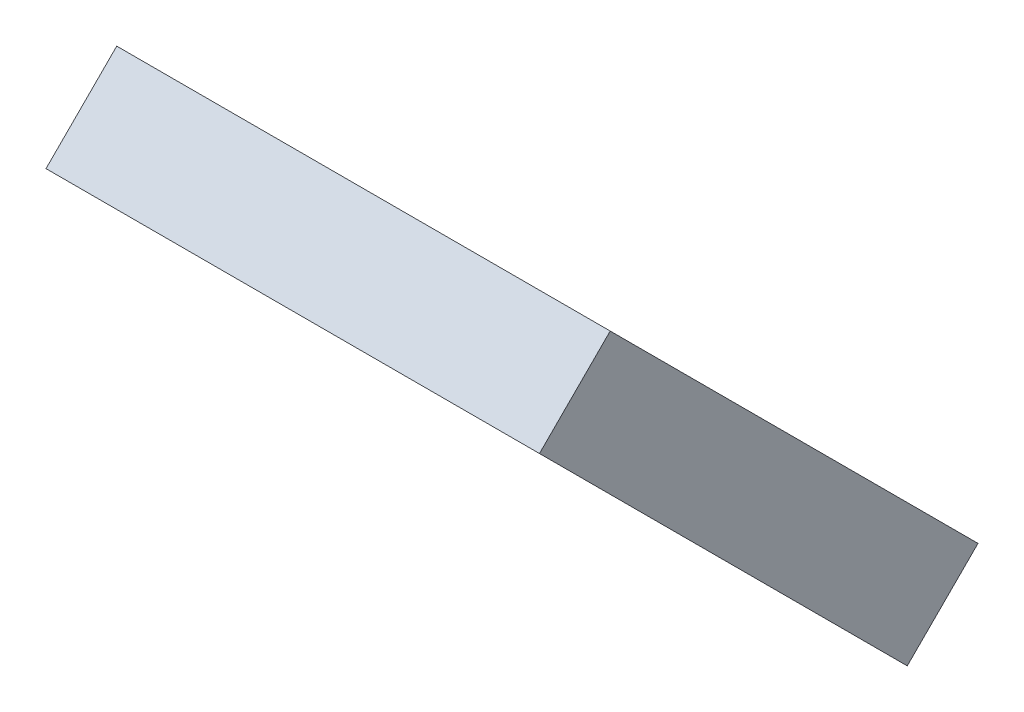
ISO-10303-21;
HEADER;
FILE_DESCRIPTION(('STEP AP214'),'2;1');
FILE_NAME('part.step','',(''),(''),'','','');
FILE_SCHEMA(('AUTOMOTIVE_DESIGN { 1 0 10303 214 1 1 1 1 }'));
ENDSEC;
DATA;
#1=APPLICATION_CONTEXT('core data for automotive mechanical design processes');
#2=APPLICATION_PROTOCOL_DEFINITION('international standard','automotive_design',2000,#1);
#3=PRODUCT_CONTEXT('',#1,'mechanical');
#4=PRODUCT('Part','Part','',(#3));
#5=PRODUCT_RELATED_PRODUCT_CATEGORY('part','',(#4));
#6=PRODUCT_DEFINITION_FORMATION('','',#4);
#7=PRODUCT_DEFINITION_CONTEXT('part definition',#1,'design');
#8=PRODUCT_DEFINITION('design','',#6,#7);
#9=PRODUCT_DEFINITION_SHAPE('','',#8);
#10=(LENGTH_UNIT() NAMED_UNIT(*) SI_UNIT(.MILLI.,.METRE.));
#11=(NAMED_UNIT(*) PLANE_ANGLE_UNIT() SI_UNIT($,.RADIAN.));
#12=(NAMED_UNIT(*) SI_UNIT($,.STERADIAN.) SOLID_ANGLE_UNIT());
#13=UNCERTAINTY_MEASURE_WITH_UNIT(LENGTH_MEASURE(1.E-05),#10,'distance_accuracy_value','');
#14=(GEOMETRIC_REPRESENTATION_CONTEXT(3) GLOBAL_UNCERTAINTY_ASSIGNED_CONTEXT((#13)) GLOBAL_UNIT_ASSIGNED_CONTEXT((#10,
#11,#12)) REPRESENTATION_CONTEXT('',''));
#15=CARTESIAN_POINT('',(0.,0.,0.));
#16=DIRECTION('',(0.,0.,1.));
#17=DIRECTION('',(1.,0.,0.));
#18=AXIS2_PLACEMENT_3D('',#15,#16,#17);
#19=CARTESIAN_POINT('',(0.,-48.5590938332494,48.559093833249));
#20=DIRECTION('',(0.,0.70710678118655,-0.707106781186545));
#21=DIRECTION('',(0.,0.707106781186545,0.70710678118655));
#22=AXIS2_PLACEMENT_3D('',#19,#20,#21);
#23=PLANE('',#22);
#24=CARTESIAN_POINT('',(73.8446097676799,44.2926792976831,141.410866964182));
#25=DIRECTION('',(0.,0.70710678118655,-0.707106781186545));
#26=DIRECTION('',(0.,0.707106781186545,0.70710678118655));
#27=AXIS2_PLACEMENT_3D('',#24,#25,#26);
#28=CIRCLE('',#27,1.99999999999999);
#29=CARTESIAN_POINT('',(73.8446097676799,45.7068928600562,142.825080526555));
#30=VERTEX_POINT('',#29);
#31=EDGE_CURVE('E141',#30,#30,#28,.T.);
#32=ORIENTED_EDGE('',*,*,#31,.F.);
#33=EDGE_LOOP('',(#32));
#34=FACE_BOUND('',#33,.T.);
#35=CARTESIAN_POINT('',(58.8446097676798,29.7969902833589,126.915177949858));
#36=DIRECTION('',(0.,0.70710678118655,-0.707106781186545));
#37=DIRECTION('',(0.,0.707106781186545,0.70710678118655));
#38=AXIS2_PLACEMENT_3D('',#35,#36,#37);
#39=CIRCLE('',#38,1.50000000000003);
#40=CARTESIAN_POINT('',(58.8446097676798,30.8576504551387,127.975838121638));
#41=VERTEX_POINT('',#40);
#42=EDGE_CURVE('E127',#41,#41,#39,.T.);
#43=ORIENTED_EDGE('',*,*,#42,.F.);
#44=EDGE_LOOP('',(#43));
#45=FACE_BOUND('',#44,.T.);
#46=CARTESIAN_POINT('',(88.8446097676799,53.1315140625149,150.249701729014));
#47=DIRECTION('',(0.,0.70710678118655,-0.707106781186545));
#48=DIRECTION('',(0.,0.707106781186545,0.70710678118655));
#49=AXIS2_PLACEMENT_3D('',#46,#47,#48);
#50=CIRCLE('',#49,1.50000000000003);
#51=CARTESIAN_POINT('',(88.8446097676799,54.1921742342947,151.310361900794));
#52=VERTEX_POINT('',#51);
#53=EDGE_CURVE('E106',#52,#52,#50,.T.);
#54=ORIENTED_EDGE('',*,*,#53,.F.);
#55=EDGE_LOOP('',(#54));
#56=FACE_BOUND('',#55,.T.);
#57=DIRECTION('',(0.,0.707106781186545,0.70710678118655));
#58=VECTOR('',#57,1.);
#59=CARTESIAN_POINT('',(55.3446097676798,55.2528344060745,152.371022072574));
#60=LINE('',#59,#58);
#61=CARTESIAN_POINT('',(55.3446097676798,27.6756699397993,124.793857606298));
#62=VERTEX_POINT('',#61);
#63=CARTESIAN_POINT('',(55.3446097676798,55.2528344060745,152.371022072574));
#64=VERTEX_POINT('',#63);
#65=EDGE_CURVE('E90',#62,#64,#60,.T.);
#66=ORIENTED_EDGE('',*,*,#65,.T.);
#67=DIRECTION('',(1.,0.,0.));
#68=VECTOR('',#67,1.);
#69=CARTESIAN_POINT('',(92.3446097676799,55.2528344060745,152.371022072574));
#70=LINE('',#69,#68);
#71=CARTESIAN_POINT('',(92.3446097676799,55.2528344060745,152.371022072574));
#72=VERTEX_POINT('',#71);
#73=EDGE_CURVE('E85',#64,#72,#70,.T.);
#74=ORIENTED_EDGE('',*,*,#73,.T.);
#75=DIRECTION('',(0.,-0.707106781186545,-0.70710678118655));
#76=VECTOR('',#75,1.);
#77=CARTESIAN_POINT('',(92.3446097676799,55.2528344060745,152.371022072574));
#78=LINE('',#77,#76);
#79=CARTESIAN_POINT('',(92.3446097676798,27.6756699397993,124.793857606298));
#80=VERTEX_POINT('',#79);
#81=EDGE_CURVE('E88',#72,#80,#78,.T.);
#82=ORIENTED_EDGE('',*,*,#81,.T.);
#83=DIRECTION('',(-1.,0.,0.));
#84=VECTOR('',#83,1.);
#85=CARTESIAN_POINT('',(92.3446097676798,27.6756699397993,124.793857606298));
#86=LINE('',#85,#84);
#87=EDGE_CURVE('E55',#80,#62,#86,.T.);
#88=ORIENTED_EDGE('',*,*,#87,.T.);
#89=EDGE_LOOP('',(#66,#74,#82,#88));
#90=FACE_BOUND('',#89,.T.);
#91=CARTESIAN_POINT('',(58.8446097676798,53.1315140625149,150.249701729014));
#92=DIRECTION('',(0.,0.70710678118655,-0.707106781186545));
#93=DIRECTION('',(0.,0.707106781186545,0.70710678118655));
#94=AXIS2_PLACEMENT_3D('',#91,#92,#93);
#95=CIRCLE('',#94,1.50000000000003);
#96=CARTESIAN_POINT('',(58.8446097676798,54.1921742342947,151.310361900794));
#97=VERTEX_POINT('',#96);
#98=EDGE_CURVE('E121',#97,#97,#95,.T.);
#99=ORIENTED_EDGE('',*,*,#98,.F.);
#100=EDGE_LOOP('',(#99));
#101=FACE_BOUND('',#100,.T.);
#102=CARTESIAN_POINT('',(88.8446097676799,29.7969902833589,126.915177949858));
#103=DIRECTION('',(0.,0.70710678118655,-0.707106781186545));
#104=DIRECTION('',(0.,0.707106781186545,0.70710678118655));
#105=AXIS2_PLACEMENT_3D('',#102,#103,#104);
#106=CIRCLE('',#105,1.50000000000003);
#107=CARTESIAN_POINT('',(88.8446097676799,30.8576504551388,127.975838121638));
#108=VERTEX_POINT('',#107);
#109=EDGE_CURVE('E133',#108,#108,#106,.T.);
#110=ORIENTED_EDGE('',*,*,#109,.F.);
#111=EDGE_LOOP('',(#110));
#112=FACE_BOUND('',#111,.T.);
#113=ADVANCED_FACE('F37',(#34,#45,#56,#90,#101,#112),#23,.T.);
#114=CARTESIAN_POINT('',(0.,-53.8623946921486,53.8623946921481));
#115=DIRECTION('',(0.,0.70710678118655,-0.707106781186545));
#116=DIRECTION('',(0.,0.707106781186545,0.70710678118655));
#117=AXIS2_PLACEMENT_3D('',#114,#115,#116);
#118=PLANE('',#117);
#119=CARTESIAN_POINT('',(73.8446097676799,38.989378438784,146.714167823081));
#120=DIRECTION('',(0.,0.70710678118655,-0.707106781186545));
#121=DIRECTION('',(0.,0.707106781186545,0.70710678118655));
#122=AXIS2_PLACEMENT_3D('',#119,#120,#121);
#123=CIRCLE('',#122,1.99999999999999);
#124=CARTESIAN_POINT('',(73.8446097676799,40.4035920011571,148.128381385455));
#125=VERTEX_POINT('',#124);
#126=EDGE_CURVE('E41',#125,#125,#123,.T.);
#127=ORIENTED_EDGE('',*,*,#126,.T.);
#128=EDGE_LOOP('',(#127));
#129=FACE_BOUND('',#128,.T.);
#130=DIRECTION('',(0.,0.707106781186545,0.70710678118655));
#131=VECTOR('',#130,1.);
#132=CARTESIAN_POINT('',(55.3446097676798,49.9495335471754,157.674322931473));
#133=LINE('',#132,#131);
#134=CARTESIAN_POINT('',(55.3446097676798,22.3723690809001,130.097158465197));
#135=VERTEX_POINT('',#134);
#136=CARTESIAN_POINT('',(55.3446097676798,49.9495335471754,157.674322931473));
#137=VERTEX_POINT('',#136);
#138=EDGE_CURVE('E103',#135,#137,#133,.T.);
#139=ORIENTED_EDGE('',*,*,#138,.F.);
#140=DIRECTION('',(-1.,0.,0.));
#141=VECTOR('',#140,1.);
#142=CARTESIAN_POINT('',(92.3446097676798,22.3723690809001,130.097158465197));
#143=LINE('',#142,#141);
#144=CARTESIAN_POINT('',(92.3446097676798,22.3723690809001,130.097158465197));
#145=VERTEX_POINT('',#144);
#146=EDGE_CURVE('E78',#145,#135,#143,.T.);
#147=ORIENTED_EDGE('',*,*,#146,.F.);
#148=DIRECTION('',(0.,-0.707106781186545,-0.70710678118655));
#149=VECTOR('',#148,1.);
#150=CARTESIAN_POINT('',(92.3446097676799,49.9495335471754,157.674322931473));
#151=LINE('',#150,#149);
#152=CARTESIAN_POINT('',(92.3446097676799,49.9495335471754,157.674322931473));
#153=VERTEX_POINT('',#152);
#154=EDGE_CURVE('E72',#153,#145,#151,.T.);
#155=ORIENTED_EDGE('',*,*,#154,.F.);
#156=DIRECTION('',(1.,0.,0.));
#157=VECTOR('',#156,1.);
#158=CARTESIAN_POINT('',(92.3446097676799,49.9495335471754,157.674322931473));
#159=LINE('',#158,#157);
#160=EDGE_CURVE('E94',#137,#153,#159,.T.);
#161=ORIENTED_EDGE('',*,*,#160,.F.);
#162=EDGE_LOOP('',(#139,#147,#155,#161));
#163=FACE_BOUND('',#162,.T.);
#164=CARTESIAN_POINT('',(88.8446097676799,47.8282132036158,155.553002587913));
#165=DIRECTION('',(0.,0.70710678118655,-0.707106781186545));
#166=DIRECTION('',(0.,0.707106781186545,0.70710678118655));
#167=AXIS2_PLACEMENT_3D('',#164,#165,#166);
#168=CIRCLE('',#167,1.50000000000003);
#169=CARTESIAN_POINT('',(88.8446097676799,48.8888733753956,156.613662759693));
#170=VERTEX_POINT('',#169);
#171=EDGE_CURVE('E118',#170,#170,#168,.T.);
#172=ORIENTED_EDGE('',*,*,#171,.T.);
#173=EDGE_LOOP('',(#172));
#174=FACE_BOUND('',#173,.T.);
#175=CARTESIAN_POINT('',(58.8446097676798,47.8282132036158,155.553002587913));
#176=DIRECTION('',(0.,0.70710678118655,-0.707106781186545));
#177=DIRECTION('',(0.,0.707106781186545,0.70710678118655));
#178=AXIS2_PLACEMENT_3D('',#175,#176,#177);
#179=CIRCLE('',#178,1.50000000000003);
#180=CARTESIAN_POINT('',(58.8446097676798,48.8888733753956,156.613662759693));
#181=VERTEX_POINT('',#180);
#182=EDGE_CURVE('E124',#181,#181,#179,.T.);
#183=ORIENTED_EDGE('',*,*,#182,.T.);
#184=EDGE_LOOP('',(#183));
#185=FACE_BOUND('',#184,.T.);
#186=CARTESIAN_POINT('',(58.8446097676798,24.4936894244598,132.218478808757));
#187=DIRECTION('',(0.,0.70710678118655,-0.707106781186545));
#188=DIRECTION('',(0.,0.707106781186545,0.70710678118655));
#189=AXIS2_PLACEMENT_3D('',#186,#187,#188);
#190=CIRCLE('',#189,1.50000000000003);
#191=CARTESIAN_POINT('',(58.8446097676798,25.5543495962396,133.279138980537));
#192=VERTEX_POINT('',#191);
#193=EDGE_CURVE('E130',#192,#192,#190,.T.);
#194=ORIENTED_EDGE('',*,*,#193,.T.);
#195=EDGE_LOOP('',(#194));
#196=FACE_BOUND('',#195,.T.);
#197=CARTESIAN_POINT('',(88.8446097676799,24.4936894244598,132.218478808757));
#198=DIRECTION('',(0.,0.70710678118655,-0.707106781186545));
#199=DIRECTION('',(0.,0.707106781186545,0.70710678118655));
#200=AXIS2_PLACEMENT_3D('',#197,#198,#199);
#201=CIRCLE('',#200,1.50000000000003);
#202=CARTESIAN_POINT('',(88.8446097676799,25.5543495962396,133.279138980537));
#203=VERTEX_POINT('',#202);
#204=EDGE_CURVE('E136',#203,#203,#201,.T.);
#205=ORIENTED_EDGE('',*,*,#204,.T.);
#206=EDGE_LOOP('',(#205));
#207=FACE_BOUND('',#206,.T.);
#208=ADVANCED_FACE('F114',(#129,#163,#174,#185,#196,#207),#118,.F.);
#209=CARTESIAN_POINT('',(55.3446097676798,55.2528344060745,152.371022072574));
#210=DIRECTION('',(1.,0.,0.));
#211=DIRECTION('',(0.,1.,0.));
#212=AXIS2_PLACEMENT_3D('',#209,#210,#211);
#213=PLANE('',#212);
#214=ORIENTED_EDGE('',*,*,#138,.T.);
#215=DIRECTION('',(0.,-0.70710678118655,0.707106781186545));
#216=VECTOR('',#215,1.);
#217=CARTESIAN_POINT('',(55.3446097676798,55.2528344060745,152.371022072574));
#218=LINE('',#217,#216);
#219=EDGE_CURVE('E11',#64,#137,#218,.T.);
#220=ORIENTED_EDGE('',*,*,#219,.F.);
#221=ORIENTED_EDGE('',*,*,#65,.F.);
#222=DIRECTION('',(0.,-0.70710678118655,0.707106781186545));
#223=VECTOR('',#222,1.);
#224=CARTESIAN_POINT('',(55.3446097676798,27.6756699397993,124.793857606298));
#225=LINE('',#224,#223);
#226=EDGE_CURVE('E99',#62,#135,#225,.T.);
#227=ORIENTED_EDGE('',*,*,#226,.T.);
#228=EDGE_LOOP('',(#214,#220,#221,#227));
#229=FACE_BOUND('',#228,.T.);
#230=ADVANCED_FACE('F39',(#229),#213,.F.);
#231=CARTESIAN_POINT('',(92.3446097676799,55.2528344060745,152.371022072574));
#232=DIRECTION('',(0.,-0.707106781186545,-0.70710678118655));
#233=DIRECTION('',(0.,0.70710678118655,-0.707106781186545));
#234=AXIS2_PLACEMENT_3D('',#231,#232,#233);
#235=PLANE('',#234);
#236=ORIENTED_EDGE('',*,*,#160,.T.);
#237=DIRECTION('',(0.,-0.70710678118655,0.707106781186545));
#238=VECTOR('',#237,1.);
#239=CARTESIAN_POINT('',(92.3446097676799,55.2528344060745,152.371022072574));
#240=LINE('',#239,#238);
#241=EDGE_CURVE('E47',#72,#153,#240,.T.);
#242=ORIENTED_EDGE('',*,*,#241,.F.);
#243=ORIENTED_EDGE('',*,*,#73,.F.);
#244=ORIENTED_EDGE('',*,*,#219,.T.);
#245=EDGE_LOOP('',(#236,#242,#243,#244));
#246=FACE_BOUND('',#245,.T.);
#247=ADVANCED_FACE('F93',(#246),#235,.F.);
#248=CARTESIAN_POINT('',(92.3446097676799,55.2528344060745,152.371022072574));
#249=DIRECTION('',(-1.,0.,0.));
#250=DIRECTION('',(0.,-1.,0.));
#251=AXIS2_PLACEMENT_3D('',#248,#249,#250);
#252=PLANE('',#251);
#253=ORIENTED_EDGE('',*,*,#154,.T.);
#254=DIRECTION('',(0.,-0.70710678118655,0.707106781186545));
#255=VECTOR('',#254,1.);
#256=CARTESIAN_POINT('',(92.3446097676798,27.6756699397993,124.793857606298));
#257=LINE('',#256,#255);
#258=EDGE_CURVE('E95',#80,#145,#257,.T.);
#259=ORIENTED_EDGE('',*,*,#258,.F.);
#260=ORIENTED_EDGE('',*,*,#81,.F.);
#261=ORIENTED_EDGE('',*,*,#241,.T.);
#262=EDGE_LOOP('',(#253,#259,#260,#261));
#263=FACE_BOUND('',#262,.T.);
#264=ADVANCED_FACE('F97',(#263),#252,.F.);
#265=CARTESIAN_POINT('',(92.3446097676798,27.6756699397993,124.793857606298));
#266=DIRECTION('',(0.,0.707106781186545,0.70710678118655));
#267=DIRECTION('',(0.,-0.70710678118655,0.707106781186545));
#268=AXIS2_PLACEMENT_3D('',#265,#266,#267);
#269=PLANE('',#268);
#270=ORIENTED_EDGE('',*,*,#146,.T.);
#271=ORIENTED_EDGE('',*,*,#226,.F.);
#272=ORIENTED_EDGE('',*,*,#87,.F.);
#273=ORIENTED_EDGE('',*,*,#258,.T.);
#274=EDGE_LOOP('',(#270,#271,#272,#273));
#275=FACE_BOUND('',#274,.T.);
#276=ADVANCED_FACE('F111',(#275),#269,.F.);
#277=CARTESIAN_POINT('',(88.8446097676799,53.1315140625149,150.249701729014));
#278=DIRECTION('',(0.,-0.70710678118655,0.707106781186545));
#279=DIRECTION('',(0.,-0.707106781186545,-0.70710678118655));
#280=AXIS2_PLACEMENT_3D('',#277,#278,#279);
#281=CYLINDRICAL_SURFACE('',#280,1.50000000000003);
#282=ORIENTED_EDGE('',*,*,#53,.T.);
#283=EDGE_LOOP('',(#282));
#284=FACE_BOUND('',#283,.T.);
#285=ORIENTED_EDGE('',*,*,#171,.F.);
#286=EDGE_LOOP('',(#285));
#287=FACE_BOUND('',#286,.T.);
#288=ADVANCED_FACE('F168',(#284,#287),#281,.F.);
#289=CARTESIAN_POINT('',(58.8446097676798,53.1315140625149,150.249701729014));
#290=DIRECTION('',(0.,-0.70710678118655,0.707106781186545));
#291=DIRECTION('',(0.,-0.707106781186545,-0.70710678118655));
#292=AXIS2_PLACEMENT_3D('',#289,#290,#291);
#293=CYLINDRICAL_SURFACE('',#292,1.50000000000003);
#294=ORIENTED_EDGE('',*,*,#98,.T.);
#295=EDGE_LOOP('',(#294));
#296=FACE_BOUND('',#295,.T.);
#297=ORIENTED_EDGE('',*,*,#182,.F.);
#298=EDGE_LOOP('',(#297));
#299=FACE_BOUND('',#298,.T.);
#300=ADVANCED_FACE('F211',(#296,#299),#293,.F.);
#301=CARTESIAN_POINT('',(58.8446097676798,29.7969902833589,126.915177949858));
#302=DIRECTION('',(0.,-0.70710678118655,0.707106781186545));
#303=DIRECTION('',(0.,-0.707106781186545,-0.70710678118655));
#304=AXIS2_PLACEMENT_3D('',#301,#302,#303);
#305=CYLINDRICAL_SURFACE('',#304,1.50000000000003);
#306=ORIENTED_EDGE('',*,*,#42,.T.);
#307=EDGE_LOOP('',(#306));
#308=FACE_BOUND('',#307,.T.);
#309=ORIENTED_EDGE('',*,*,#193,.F.);
#310=EDGE_LOOP('',(#309));
#311=FACE_BOUND('',#310,.T.);
#312=ADVANCED_FACE('F156',(#308,#311),#305,.F.);
#313=CARTESIAN_POINT('',(88.8446097676799,29.7969902833589,126.915177949858));
#314=DIRECTION('',(0.,-0.70710678118655,0.707106781186545));
#315=DIRECTION('',(0.,-0.707106781186545,-0.70710678118655));
#316=AXIS2_PLACEMENT_3D('',#313,#314,#315);
#317=CYLINDRICAL_SURFACE('',#316,1.50000000000003);
#318=ORIENTED_EDGE('',*,*,#109,.T.);
#319=EDGE_LOOP('',(#318));
#320=FACE_BOUND('',#319,.T.);
#321=ORIENTED_EDGE('',*,*,#204,.F.);
#322=EDGE_LOOP('',(#321));
#323=FACE_BOUND('',#322,.T.);
#324=ADVANCED_FACE('F151',(#320,#323),#317,.F.);
#325=CARTESIAN_POINT('',(73.8446097676799,25.2007962056462,160.502750056219));
#326=DIRECTION('',(0.,0.70710678118655,-0.707106781186545));
#327=DIRECTION('',(0.,0.707106781186545,0.70710678118655));
#328=AXIS2_PLACEMENT_3D('',#325,#326,#327);
#329=CYLINDRICAL_SURFACE('',#328,1.99999999999999);
#330=ORIENTED_EDGE('',*,*,#31,.T.);
#331=EDGE_LOOP('',(#330));
#332=FACE_BOUND('',#331,.T.);
#333=ORIENTED_EDGE('',*,*,#126,.F.);
#334=EDGE_LOOP('',(#333));
#335=FACE_BOUND('',#334,.T.);
#336=ADVANCED_FACE('F149',(#332,#335),#329,.F.);
#337=CLOSED_SHELL('',(#113,#208,#230,#247,#264,#276,#288,#300,#312,#324,#336));
#338=MANIFOLD_SOLID_BREP('B2',#337);
#339=ADVANCED_BREP_SHAPE_REPRESENTATION('',(#18,#338),#14);
#340=SHAPE_DEFINITION_REPRESENTATION(#9,#339);
ENDSEC;
END-ISO-10303-21;
